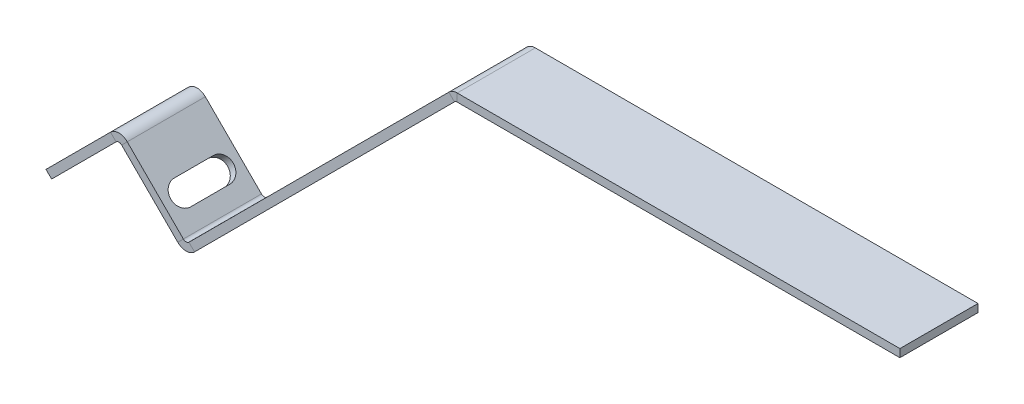
ISO-10303-21;
HEADER;
FILE_DESCRIPTION(('STEP AP214'),'2;1');
FILE_NAME('part.step','',(''),(''),'','','');
FILE_SCHEMA(('AUTOMOTIVE_DESIGN { 1 0 10303 214 1 1 1 1 }'));
ENDSEC;
DATA;
#1=APPLICATION_CONTEXT('core data for automotive mechanical design processes');
#2=APPLICATION_PROTOCOL_DEFINITION('international standard','automotive_design',2000,#1);
#3=PRODUCT_CONTEXT('',#1,'mechanical');
#4=PRODUCT('Part','Part','',(#3));
#5=PRODUCT_RELATED_PRODUCT_CATEGORY('part','',(#4));
#6=PRODUCT_DEFINITION_FORMATION('','',#4);
#7=PRODUCT_DEFINITION_CONTEXT('part definition',#1,'design');
#8=PRODUCT_DEFINITION('design','',#6,#7);
#9=PRODUCT_DEFINITION_SHAPE('','',#8);
#10=(LENGTH_UNIT() NAMED_UNIT(*) SI_UNIT(.MILLI.,.METRE.));
#11=(NAMED_UNIT(*) PLANE_ANGLE_UNIT() SI_UNIT($,.RADIAN.));
#12=(NAMED_UNIT(*) SI_UNIT($,.STERADIAN.) SOLID_ANGLE_UNIT());
#13=UNCERTAINTY_MEASURE_WITH_UNIT(LENGTH_MEASURE(1.E-05),#10,'distance_accuracy_value','');
#14=(GEOMETRIC_REPRESENTATION_CONTEXT(3) GLOBAL_UNCERTAINTY_ASSIGNED_CONTEXT((#13)) GLOBAL_UNIT_ASSIGNED_CONTEXT((#10,
#11,#12)) REPRESENTATION_CONTEXT('',''));
#15=CARTESIAN_POINT('',(0.,0.,0.));
#16=DIRECTION('',(0.,0.,1.));
#17=DIRECTION('',(1.,0.,0.));
#18=AXIS2_PLACEMENT_3D('',#15,#16,#17);
#19=CARTESIAN_POINT('',(-0.707106781186552,10.5182133701499,10.));
#20=DIRECTION('',(0.,0.,1.));
#21=DIRECTION('',(1.,0.,0.));
#22=AXIS2_PLACEMENT_3D('',#19,#20,#21);
#23=PLANE('',#22);
#24=DIRECTION('',(-0.70710678118655,0.707106781186545,0.));
#25=VECTOR('',#24,1.);
#26=CARTESIAN_POINT('',(-0.707106781186552,10.5182133701499,10.));
#27=LINE('',#26,#25);
#28=CARTESIAN_POINT('',(-0.707106781186552,10.5182133701499,10.));
#29=VERTEX_POINT('',#28);
#30=CARTESIAN_POINT('',(-2.14394776055762,11.955054349521,10.));
#31=VERTEX_POINT('',#30);
#32=EDGE_CURVE('E11',#29,#31,#27,.T.);
#33=ORIENTED_EDGE('',*,*,#32,.F.);
#34=CARTESIAN_POINT('',(0.,9.81110658896337,10.));
#35=DIRECTION('',(0.,0.,1.));
#36=DIRECTION('',(1.,0.,0.));
#37=AXIS2_PLACEMENT_3D('',#34,#35,#36);
#38=CIRCLE('',#37,1.);
#39=CARTESIAN_POINT('',(0.707106781186548,10.5182133701499,10.));
#40=VERTEX_POINT('',#39);
#41=EDGE_CURVE('E295',#29,#40,#38,.F.);
#42=ORIENTED_EDGE('',*,*,#41,.T.);
#43=DIRECTION('',(-0.707106781186549,-0.707106781186546,0.));
#44=VECTOR('',#43,1.);
#45=CARTESIAN_POINT('',(2.14394776055761,11.955054349521,10.));
#46=LINE('',#45,#44);
#47=CARTESIAN_POINT('',(2.14394776055761,11.955054349521,10.));
#48=VERTEX_POINT('',#47);
#49=EDGE_CURVE('E41',#48,#40,#46,.T.);
#50=ORIENTED_EDGE('',*,*,#49,.F.);
#51=CARTESIAN_POINT('',(0.,9.81110658896337,10.));
#52=DIRECTION('',(0.,0.,1.));
#53=DIRECTION('',(1.,0.,0.));
#54=AXIS2_PLACEMENT_3D('',#51,#52,#53);
#55=CIRCLE('',#54,3.032);
#56=EDGE_CURVE('E283',#31,#48,#55,.F.);
#57=ORIENTED_EDGE('',*,*,#56,.F.);
#58=EDGE_LOOP('',(#33,#42,#50,#57));
#59=FACE_BOUND('',#58,.T.);
#60=ADVANCED_FACE('F34',(#59),#23,.T.);
#61=CARTESIAN_POINT('',(2.14394776055761,11.955054349521,10.));
#62=DIRECTION('',(0.,0.,1.));
#63=DIRECTION('',(1.,0.,0.));
#64=AXIS2_PLACEMENT_3D('',#61,#62,#63);
#65=PLANE('',#64);
#66=DIRECTION('',(0.707106781186546,0.707106781186549,0.));
#67=VECTOR('',#66,1.);
#68=CARTESIAN_POINT('',(-17.2253201513364,-6.,10.));
#69=LINE('',#68,#67);
#70=CARTESIAN_POINT('',(-17.2253201513364,-6.,10.));
#71=VERTEX_POINT('',#70);
#72=EDGE_CURVE('E292',#71,#29,#69,.T.);
#73=ORIENTED_EDGE('',*,*,#72,.T.);
#74=ORIENTED_EDGE('',*,*,#32,.T.);
#75=DIRECTION('',(0.707106781186546,0.707106781186549,0.));
#76=VECTOR('',#75,1.);
#77=CARTESIAN_POINT('',(-18.6621611307075,-4.56315902062894,10.));
#78=LINE('',#77,#76);
#79=CARTESIAN_POINT('',(-18.6621611307075,-4.56315902062894,10.));
#80=VERTEX_POINT('',#79);
#81=EDGE_CURVE('E286',#80,#31,#78,.T.);
#82=ORIENTED_EDGE('',*,*,#81,.F.);
#83=DIRECTION('',(-0.707106781186549,0.707106781186546,0.));
#84=VECTOR('',#83,1.);
#85=CARTESIAN_POINT('',(-17.2253201513364,-6.,10.));
#86=LINE('',#85,#84);
#87=EDGE_CURVE('E289',#71,#80,#86,.T.);
#88=ORIENTED_EDGE('',*,*,#87,.F.);
#89=EDGE_LOOP('',(#73,#74,#82,#88));
#90=FACE_BOUND('',#89,.T.);
#91=ADVANCED_FACE('F460',(#90),#65,.T.);
#92=CARTESIAN_POINT('',(0.707106781186548,10.5182133701499,-10.));
#93=DIRECTION('',(0.,0.,-1.));
#94=DIRECTION('',(-1.,0.,0.));
#95=AXIS2_PLACEMENT_3D('',#92,#93,#94);
#96=PLANE('',#95);
#97=DIRECTION('',(0.707106781186549,0.707106781186546,0.));
#98=VECTOR('',#97,1.);
#99=CARTESIAN_POINT('',(0.707106781186548,10.5182133701499,-10.));
#100=LINE('',#99,#98);
#101=CARTESIAN_POINT('',(0.707106781186548,10.5182133701499,-10.));
#102=VERTEX_POINT('',#101);
#103=CARTESIAN_POINT('',(2.14394776055761,11.955054349521,-10.));
#104=VERTEX_POINT('',#103);
#105=EDGE_CURVE('E418',#102,#104,#100,.T.);
#106=ORIENTED_EDGE('',*,*,#105,.F.);
#107=CARTESIAN_POINT('',(0.,9.81110658896337,-10.));
#108=DIRECTION('',(0.,0.,1.));
#109=DIRECTION('',(1.,0.,0.));
#110=AXIS2_PLACEMENT_3D('',#107,#108,#109);
#111=CIRCLE('',#110,1.);
#112=CARTESIAN_POINT('',(-0.707106781186552,10.5182133701499,-10.));
#113=VERTEX_POINT('',#112);
#114=EDGE_CURVE('E343',#113,#102,#111,.F.);
#115=ORIENTED_EDGE('',*,*,#114,.F.);
#116=DIRECTION('',(0.70710678118655,-0.707106781186545,0.));
#117=VECTOR('',#116,1.);
#118=CARTESIAN_POINT('',(-2.14394776055762,11.955054349521,-10.));
#119=LINE('',#118,#117);
#120=CARTESIAN_POINT('',(-2.14394776055762,11.955054349521,-10.));
#121=VERTEX_POINT('',#120);
#122=EDGE_CURVE('E416',#121,#113,#119,.T.);
#123=ORIENTED_EDGE('',*,*,#122,.F.);
#124=CARTESIAN_POINT('',(0.,9.81110658896337,-10.));
#125=DIRECTION('',(0.,0.,1.));
#126=DIRECTION('',(1.,0.,0.));
#127=AXIS2_PLACEMENT_3D('',#124,#125,#126);
#128=CIRCLE('',#127,3.032);
#129=EDGE_CURVE('E331',#121,#104,#128,.F.);
#130=ORIENTED_EDGE('',*,*,#129,.T.);
#131=EDGE_LOOP('',(#106,#115,#123,#130));
#132=FACE_BOUND('',#131,.T.);
#133=ADVANCED_FACE('F470',(#132),#96,.T.);
#134=CARTESIAN_POINT('',(-2.14394776055762,11.955054349521,-10.));
#135=DIRECTION('',(0.,0.,-1.));
#136=DIRECTION('',(-1.,0.,0.));
#137=AXIS2_PLACEMENT_3D('',#134,#135,#136);
#138=PLANE('',#137);
#139=DIRECTION('',(0.707106781186546,-0.707106781186549,0.));
#140=VECTOR('',#139,1.);
#141=CARTESIAN_POINT('',(0.,11.2253201513365,-10.));
#142=LINE('',#141,#140);
#143=CARTESIAN_POINT('',(15.0813723907788,-3.85605223944237,-10.));
#144=VERTEX_POINT('',#143);
#145=EDGE_CURVE('E346',#102,#144,#142,.T.);
#146=ORIENTED_EDGE('',*,*,#145,.F.);
#147=ORIENTED_EDGE('',*,*,#105,.T.);
#148=DIRECTION('',(0.707106781186546,-0.707106781186549,0.));
#149=VECTOR('',#148,1.);
#150=CARTESIAN_POINT('',(1.43684097937107,12.6621611307075,-10.));
#151=LINE('',#150,#149);
#152=CARTESIAN_POINT('',(16.5182133701498,-2.41921126007131,-10.));
#153=VERTEX_POINT('',#152);
#154=EDGE_CURVE('E328',#104,#153,#151,.T.);
#155=ORIENTED_EDGE('',*,*,#154,.T.);
#156=DIRECTION('',(-0.70710678118655,-0.707106781186545,0.));
#157=VECTOR('',#156,1.);
#158=CARTESIAN_POINT('',(16.5182133701498,-2.41921126007131,-10.));
#159=LINE('',#158,#157);
#160=EDGE_CURVE('E408',#153,#144,#159,.T.);
#161=ORIENTED_EDGE('',*,*,#160,.T.);
#162=EDGE_LOOP('',(#146,#147,#155,#161));
#163=FACE_BOUND('',#162,.T.);
#164=ADVANCED_FACE('F472',(#163),#138,.T.);
#165=CARTESIAN_POINT('',(15.0813723907788,-3.85605223944237,10.));
#166=DIRECTION('',(0.,0.,1.));
#167=DIRECTION('',(1.,0.,0.));
#168=AXIS2_PLACEMENT_3D('',#165,#166,#167);
#169=PLANE('',#168);
#170=DIRECTION('',(0.70710678118655,0.707106781186545,0.));
#171=VECTOR('',#170,1.);
#172=CARTESIAN_POINT('',(15.0813723907788,-3.85605223944237,10.));
#173=LINE('',#172,#171);
#174=CARTESIAN_POINT('',(15.0813723907788,-3.85605223944237,10.));
#175=VERTEX_POINT('',#174);
#176=CARTESIAN_POINT('',(16.5182133701498,-2.41921126007131,10.));
#177=VERTEX_POINT('',#176);
#178=EDGE_CURVE('E414',#175,#177,#173,.T.);
#179=ORIENTED_EDGE('',*,*,#178,.F.);
#180=CARTESIAN_POINT('',(17.2253201513364,-1.71210447888477,10.));
#181=DIRECTION('',(0.,0.,-1.));
#182=DIRECTION('',(-1.,0.,0.));
#183=AXIS2_PLACEMENT_3D('',#180,#181,#182);
#184=CIRCLE('',#183,3.032);
#185=CARTESIAN_POINT('',(19.369267911894,-3.85605223944238,10.));
#186=VERTEX_POINT('',#185);
#187=EDGE_CURVE('E301',#175,#186,#184,.F.);
#188=ORIENTED_EDGE('',*,*,#187,.T.);
#189=DIRECTION('',(0.707106781186549,-0.707106781186546,0.));
#190=VECTOR('',#189,1.);
#191=CARTESIAN_POINT('',(17.9324269325229,-2.41921126007131,10.));
#192=LINE('',#191,#190);
#193=CARTESIAN_POINT('',(17.9324269325229,-2.41921126007131,10.));
#194=VERTEX_POINT('',#193);
#195=EDGE_CURVE('E412',#194,#186,#192,.T.);
#196=ORIENTED_EDGE('',*,*,#195,.F.);
#197=CARTESIAN_POINT('',(17.2253201513364,-1.71210447888477,10.));
#198=DIRECTION('',(0.,0.,1.));
#199=DIRECTION('',(1.,0.,0.));
#200=AXIS2_PLACEMENT_3D('',#197,#198,#199);
#201=CIRCLE('',#200,1.);
#202=EDGE_CURVE('E277',#177,#194,#201,.T.);
#203=ORIENTED_EDGE('',*,*,#202,.F.);
#204=EDGE_LOOP('',(#179,#188,#196,#203));
#205=FACE_BOUND('',#204,.T.);
#206=ADVANCED_FACE('F440',(#205),#169,.T.);
#207=CARTESIAN_POINT('',(17.9324269325229,-2.41921126007131,10.));
#208=DIRECTION('',(0.,0.,1.));
#209=DIRECTION('',(1.,0.,0.));
#210=AXIS2_PLACEMENT_3D('',#207,#208,#209);
#211=PLANE('',#210);
#212=DIRECTION('',(0.707106781186546,-0.707106781186549,0.));
#213=VECTOR('',#212,1.);
#214=CARTESIAN_POINT('',(0.,11.2253201513365,10.));
#215=LINE('',#214,#213);
#216=EDGE_CURVE('E298',#40,#175,#215,.T.);
#217=ORIENTED_EDGE('',*,*,#216,.T.);
#218=ORIENTED_EDGE('',*,*,#178,.T.);
#219=DIRECTION('',(0.707106781186546,-0.707106781186549,0.));
#220=VECTOR('',#219,1.);
#221=CARTESIAN_POINT('',(1.43684097937107,12.6621611307075,10.));
#222=LINE('',#221,#220);
#223=EDGE_CURVE('E280',#48,#177,#222,.T.);
#224=ORIENTED_EDGE('',*,*,#223,.F.);
#225=ORIENTED_EDGE('',*,*,#49,.T.);
#226=EDGE_LOOP('',(#217,#218,#224,#225));
#227=FACE_BOUND('',#226,.T.);
#228=ADVANCED_FACE('F421',(#227),#211,.T.);
#229=CARTESIAN_POINT('',(19.369267911894,-3.85605223944238,-10.));
#230=DIRECTION('',(0.,0.,-1.));
#231=DIRECTION('',(-1.,0.,0.));
#232=AXIS2_PLACEMENT_3D('',#229,#230,#231);
#233=PLANE('',#232);
#234=DIRECTION('',(-0.707106781186549,0.707106781186546,0.));
#235=VECTOR('',#234,1.);
#236=CARTESIAN_POINT('',(19.369267911894,-3.85605223944238,-10.));
#237=LINE('',#236,#235);
#238=CARTESIAN_POINT('',(19.369267911894,-3.85605223944238,-10.));
#239=VERTEX_POINT('',#238);
#240=CARTESIAN_POINT('',(17.9324269325229,-2.41921126007131,-10.));
#241=VERTEX_POINT('',#240);
#242=EDGE_CURVE('E410',#239,#241,#237,.T.);
#243=ORIENTED_EDGE('',*,*,#242,.F.);
#244=CARTESIAN_POINT('',(17.2253201513364,-1.71210447888477,-10.));
#245=DIRECTION('',(0.,0.,-1.));
#246=DIRECTION('',(-1.,0.,0.));
#247=AXIS2_PLACEMENT_3D('',#244,#245,#246);
#248=CIRCLE('',#247,3.032);
#249=EDGE_CURVE('E349',#144,#239,#248,.F.);
#250=ORIENTED_EDGE('',*,*,#249,.F.);
#251=ORIENTED_EDGE('',*,*,#160,.F.);
#252=CARTESIAN_POINT('',(17.2253201513364,-1.71210447888477,-10.));
#253=DIRECTION('',(0.,0.,1.));
#254=DIRECTION('',(1.,0.,0.));
#255=AXIS2_PLACEMENT_3D('',#252,#253,#254);
#256=CIRCLE('',#255,1.);
#257=EDGE_CURVE('E325',#153,#241,#256,.T.);
#258=ORIENTED_EDGE('',*,*,#257,.T.);
#259=EDGE_LOOP('',(#243,#250,#251,#258));
#260=FACE_BOUND('',#259,.T.);
#261=ADVANCED_FACE('F474',(#260),#233,.T.);
#262=CARTESIAN_POINT('',(16.5182133701498,-2.41921126007131,-10.));
#263=DIRECTION('',(0.,0.,-1.));
#264=DIRECTION('',(-1.,0.,0.));
#265=AXIS2_PLACEMENT_3D('',#262,#263,#264);
#266=PLANE('',#265);
#267=DIRECTION('',(0.707106781186546,0.707106781186549,0.));
#268=VECTOR('',#267,1.);
#269=CARTESIAN_POINT('',(17.2253201513364,-6.,-10.));
#270=LINE('',#269,#268);
#271=CARTESIAN_POINT('',(85.9324269325227,62.7071067811865,-10.));
#272=VERTEX_POINT('',#271);
#273=EDGE_CURVE('E352',#239,#272,#270,.T.);
#274=ORIENTED_EDGE('',*,*,#273,.F.);
#275=ORIENTED_EDGE('',*,*,#242,.T.);
#276=DIRECTION('',(0.707106781186546,0.707106781186549,0.));
#277=VECTOR('',#276,1.);
#278=CARTESIAN_POINT('',(15.7884791719653,-4.56315902062894,-10.));
#279=LINE('',#278,#277);
#280=CARTESIAN_POINT('',(84.4955859531516,64.1439477605576,-10.));
#281=VERTEX_POINT('',#280);
#282=EDGE_CURVE('E322',#241,#281,#279,.T.);
#283=ORIENTED_EDGE('',*,*,#282,.T.);
#284=DIRECTION('',(0.707106781186548,-0.707106781186548,0.));
#285=VECTOR('',#284,1.);
#286=CARTESIAN_POINT('',(84.4955859531516,64.1439477605576,-10.));
#287=LINE('',#286,#285);
#288=EDGE_CURVE('E400',#281,#272,#287,.T.);
#289=ORIENTED_EDGE('',*,*,#288,.T.);
#290=EDGE_LOOP('',(#274,#275,#283,#289));
#291=FACE_BOUND('',#290,.T.);
#292=ADVANCED_FACE('F480',(#291),#266,.T.);
#293=CARTESIAN_POINT('',(85.9324269325227,62.7071067811865,10.));
#294=DIRECTION('',(0.,0.,1.));
#295=DIRECTION('',(1.,0.,0.));
#296=AXIS2_PLACEMENT_3D('',#293,#294,#295);
#297=PLANE('',#296);
#298=DIRECTION('',(-0.707106781186548,0.707106781186548,0.));
#299=VECTOR('',#298,1.);
#300=CARTESIAN_POINT('',(85.9324269325227,62.7071067811865,10.));
#301=LINE('',#300,#299);
#302=CARTESIAN_POINT('',(85.9324269325227,62.7071067811865,10.));
#303=VERTEX_POINT('',#302);
#304=CARTESIAN_POINT('',(84.4955859531516,64.1439477605576,10.));
#305=VERTEX_POINT('',#304);
#306=EDGE_CURVE('E406',#303,#305,#301,.T.);
#307=ORIENTED_EDGE('',*,*,#306,.F.);
#308=CARTESIAN_POINT('',(86.6395337137093,62.,10.));
#309=DIRECTION('',(0.,0.,1.));
#310=DIRECTION('',(1.,0.,0.));
#311=AXIS2_PLACEMENT_3D('',#308,#309,#310);
#312=CIRCLE('',#311,1.);
#313=CARTESIAN_POINT('',(86.6395337137093,63.,10.));
#314=VERTEX_POINT('',#313);
#315=EDGE_CURVE('E307',#303,#314,#312,.F.);
#316=ORIENTED_EDGE('',*,*,#315,.T.);
#317=DIRECTION('',(0.,-1.,0.));
#318=VECTOR('',#317,1.);
#319=CARTESIAN_POINT('',(86.6395337137093,65.032,10.));
#320=LINE('',#319,#318);
#321=CARTESIAN_POINT('',(86.6395337137093,65.032,10.));
#322=VERTEX_POINT('',#321);
#323=EDGE_CURVE('E404',#322,#314,#320,.T.);
#324=ORIENTED_EDGE('',*,*,#323,.F.);
#325=CARTESIAN_POINT('',(86.6395337137093,62.,10.));
#326=DIRECTION('',(0.,0.,1.));
#327=DIRECTION('',(1.,0.,0.));
#328=AXIS2_PLACEMENT_3D('',#325,#326,#327);
#329=CIRCLE('',#328,3.032);
#330=EDGE_CURVE('E271',#305,#322,#329,.F.);
#331=ORIENTED_EDGE('',*,*,#330,.F.);
#332=EDGE_LOOP('',(#307,#316,#324,#331));
#333=FACE_BOUND('',#332,.T.);
#334=ADVANCED_FACE('F514',(#333),#297,.T.);
#335=CARTESIAN_POINT('',(86.6395337137093,65.032,10.));
#336=DIRECTION('',(0.,0.,1.));
#337=DIRECTION('',(1.,0.,0.));
#338=AXIS2_PLACEMENT_3D('',#335,#336,#337);
#339=PLANE('',#338);
#340=DIRECTION('',(0.707106781186546,0.707106781186549,0.));
#341=VECTOR('',#340,1.);
#342=CARTESIAN_POINT('',(17.2253201513364,-6.,10.));
#343=LINE('',#342,#341);
#344=EDGE_CURVE('E304',#186,#303,#343,.T.);
#345=ORIENTED_EDGE('',*,*,#344,.T.);
#346=ORIENTED_EDGE('',*,*,#306,.T.);
#347=DIRECTION('',(0.707106781186546,0.707106781186549,0.));
#348=VECTOR('',#347,1.);
#349=CARTESIAN_POINT('',(15.7884791719653,-4.56315902062894,10.));
#350=LINE('',#349,#348);
#351=EDGE_CURVE('E274',#194,#305,#350,.T.);
#352=ORIENTED_EDGE('',*,*,#351,.F.);
#353=ORIENTED_EDGE('',*,*,#195,.T.);
#354=EDGE_LOOP('',(#345,#346,#352,#353));
#355=FACE_BOUND('',#354,.T.);
#356=ADVANCED_FACE('F516',(#355),#339,.T.);
#357=CARTESIAN_POINT('',(86.6395337137093,63.,-10.));
#358=DIRECTION('',(0.,0.,-1.));
#359=DIRECTION('',(-1.,0.,0.));
#360=AXIS2_PLACEMENT_3D('',#357,#358,#359);
#361=PLANE('',#360);
#362=DIRECTION('',(0.,1.,0.));
#363=VECTOR('',#362,1.);
#364=CARTESIAN_POINT('',(86.6395337137093,63.,-10.));
#365=LINE('',#364,#363);
#366=CARTESIAN_POINT('',(86.6395337137093,63.,-10.));
#367=VERTEX_POINT('',#366);
#368=CARTESIAN_POINT('',(86.6395337137093,65.032,-10.));
#369=VERTEX_POINT('',#368);
#370=EDGE_CURVE('E402',#367,#369,#365,.T.);
#371=ORIENTED_EDGE('',*,*,#370,.F.);
#372=CARTESIAN_POINT('',(86.6395337137093,62.,-10.));
#373=DIRECTION('',(0.,0.,1.));
#374=DIRECTION('',(1.,0.,0.));
#375=AXIS2_PLACEMENT_3D('',#372,#373,#374);
#376=CIRCLE('',#375,1.);
#377=EDGE_CURVE('E265',#272,#367,#376,.F.);
#378=ORIENTED_EDGE('',*,*,#377,.F.);
#379=ORIENTED_EDGE('',*,*,#288,.F.);
#380=CARTESIAN_POINT('',(86.6395337137093,62.,-10.));
#381=DIRECTION('',(0.,0.,1.));
#382=DIRECTION('',(1.,0.,0.));
#383=AXIS2_PLACEMENT_3D('',#380,#381,#382);
#384=CIRCLE('',#383,3.032);
#385=EDGE_CURVE('E319',#281,#369,#384,.F.);
#386=ORIENTED_EDGE('',*,*,#385,.T.);
#387=EDGE_LOOP('',(#371,#378,#379,#386));
#388=FACE_BOUND('',#387,.T.);
#389=ADVANCED_FACE('F484',(#388),#361,.T.);
#390=CARTESIAN_POINT('',(84.4955859531516,64.1439477605576,-10.));
#391=DIRECTION('',(0.,0.,-1.));
#392=DIRECTION('',(-1.,0.,0.));
#393=AXIS2_PLACEMENT_3D('',#390,#391,#392);
#394=PLANE('',#393);
#395=DIRECTION('',(1.,0.,0.));
#396=VECTOR('',#395,1.);
#397=CARTESIAN_POINT('',(86.2253201513362,63.,-10.));
#398=LINE('',#397,#396);
#399=CARTESIAN_POINT('',(200.,63.,-10.));
#400=VERTEX_POINT('',#399);
#401=EDGE_CURVE('E255',#367,#400,#398,.T.);
#402=ORIENTED_EDGE('',*,*,#401,.F.);
#403=ORIENTED_EDGE('',*,*,#370,.T.);
#404=DIRECTION('',(1.,0.,0.));
#405=VECTOR('',#404,1.);
#406=CARTESIAN_POINT('',(86.2253201513362,65.032,-10.));
#407=LINE('',#406,#405);
#408=CARTESIAN_POINT('',(200.,65.032,-10.));
#409=VERTEX_POINT('',#408);
#410=EDGE_CURVE('E316',#369,#409,#407,.T.);
#411=ORIENTED_EDGE('',*,*,#410,.T.);
#412=DIRECTION('',(0.,-1.,0.));
#413=VECTOR('',#412,1.);
#414=CARTESIAN_POINT('',(200.,65.032,-10.));
#415=LINE('',#414,#413);
#416=EDGE_CURVE('E313',#409,#400,#415,.T.);
#417=ORIENTED_EDGE('',*,*,#416,.T.);
#418=EDGE_LOOP('',(#402,#403,#411,#417));
#419=FACE_BOUND('',#418,.T.);
#420=ADVANCED_FACE('F501',(#419),#394,.T.);
#421=CARTESIAN_POINT('',(86.2253201513362,63.,10.));
#422=DIRECTION('',(0.,1.,0.));
#423=DIRECTION('',(0.,0.,1.));
#424=AXIS2_PLACEMENT_3D('',#421,#422,#423);
#425=PLANE('',#424);
#426=ORIENTED_EDGE('',*,*,#401,.T.);
#427=DIRECTION('',(0.,0.,-1.));
#428=VECTOR('',#427,1.);
#429=CARTESIAN_POINT('',(200.,63.,10.));
#430=LINE('',#429,#428);
#431=CARTESIAN_POINT('',(200.,63.,10.));
#432=VERTEX_POINT('',#431);
#433=EDGE_CURVE('E398',#432,#400,#430,.T.);
#434=ORIENTED_EDGE('',*,*,#433,.F.);
#435=DIRECTION('',(1.,0.,0.));
#436=VECTOR('',#435,1.);
#437=CARTESIAN_POINT('',(86.2253201513362,63.,10.));
#438=LINE('',#437,#436);
#439=EDGE_CURVE('E262',#314,#432,#438,.T.);
#440=ORIENTED_EDGE('',*,*,#439,.F.);
#441=DIRECTION('',(0.,0.,-1.));
#442=VECTOR('',#441,1.);
#443=CARTESIAN_POINT('',(86.6395337137093,63.,10.));
#444=LINE('',#443,#442);
#445=EDGE_CURVE('E310',#314,#367,#444,.T.);
#446=ORIENTED_EDGE('',*,*,#445,.T.);
#447=EDGE_LOOP('',(#426,#434,#440,#446));
#448=FACE_BOUND('',#447,.T.);
#449=ADVANCED_FACE('F508',(#448),#425,.F.);
#450=CARTESIAN_POINT('',(200.,65.032,10.));
#451=DIRECTION('',(1.,0.,0.));
#452=DIRECTION('',(0.,0.,-1.));
#453=AXIS2_PLACEMENT_3D('',#450,#451,#452);
#454=PLANE('',#453);
#455=ORIENTED_EDGE('',*,*,#416,.F.);
#456=DIRECTION('',(0.,0.,-1.));
#457=VECTOR('',#456,1.);
#458=CARTESIAN_POINT('',(200.,65.032,10.));
#459=LINE('',#458,#457);
#460=CARTESIAN_POINT('',(200.,65.032,10.));
#461=VERTEX_POINT('',#460);
#462=EDGE_CURVE('E396',#461,#409,#459,.T.);
#463=ORIENTED_EDGE('',*,*,#462,.F.);
#464=DIRECTION('',(0.,-1.,0.));
#465=VECTOR('',#464,1.);
#466=CARTESIAN_POINT('',(200.,65.032,10.));
#467=LINE('',#466,#465);
#468=EDGE_CURVE('E264',#461,#432,#467,.T.);
#469=ORIENTED_EDGE('',*,*,#468,.T.);
#470=ORIENTED_EDGE('',*,*,#433,.T.);
#471=EDGE_LOOP('',(#455,#463,#469,#470));
#472=FACE_BOUND('',#471,.T.);
#473=ADVANCED_FACE('F582',(#472),#454,.T.);
#474=CARTESIAN_POINT('',(86.2253201513362,65.032,10.));
#475=DIRECTION('',(0.,1.,0.));
#476=DIRECTION('',(0.,0.,1.));
#477=AXIS2_PLACEMENT_3D('',#474,#475,#476);
#478=PLANE('',#477);
#479=ORIENTED_EDGE('',*,*,#410,.F.);
#480=DIRECTION('',(0.,0.,-1.));
#481=VECTOR('',#480,1.);
#482=CARTESIAN_POINT('',(86.6395337137093,65.032,10.));
#483=LINE('',#482,#481);
#484=EDGE_CURVE('E393',#322,#369,#483,.T.);
#485=ORIENTED_EDGE('',*,*,#484,.F.);
#486=DIRECTION('',(1.,0.,0.));
#487=VECTOR('',#486,1.);
#488=CARTESIAN_POINT('',(86.2253201513362,65.032,10.));
#489=LINE('',#488,#487);
#490=EDGE_CURVE('E268',#322,#461,#489,.T.);
#491=ORIENTED_EDGE('',*,*,#490,.T.);
#492=ORIENTED_EDGE('',*,*,#462,.T.);
#493=EDGE_LOOP('',(#479,#485,#491,#492));
#494=FACE_BOUND('',#493,.T.);
#495=ADVANCED_FACE('F497',(#494),#478,.T.);
#496=CARTESIAN_POINT('',(86.6395337137093,62.,10.));
#497=DIRECTION('',(0.,0.,-1.));
#498=DIRECTION('',(-1.,0.,0.));
#499=AXIS2_PLACEMENT_3D('',#496,#497,#498);
#500=CYLINDRICAL_SURFACE('',#499,3.032);
#501=ORIENTED_EDGE('',*,*,#385,.F.);
#502=DIRECTION('',(0.,0.,-1.));
#503=VECTOR('',#502,1.);
#504=CARTESIAN_POINT('',(84.4955859531516,64.1439477605576,10.));
#505=LINE('',#504,#503);
#506=EDGE_CURVE('E390',#305,#281,#505,.T.);
#507=ORIENTED_EDGE('',*,*,#506,.F.);
#508=ORIENTED_EDGE('',*,*,#330,.T.);
#509=ORIENTED_EDGE('',*,*,#484,.T.);
#510=EDGE_LOOP('',(#501,#507,#508,#509));
#511=FACE_BOUND('',#510,.T.);
#512=ADVANCED_FACE('F492',(#511),#500,.T.);
#513=CARTESIAN_POINT('',(15.7884791719653,-4.56315902062894,10.));
#514=DIRECTION('',(-0.707106781186549,0.707106781186546,0.));
#515=DIRECTION('',(-0.707106781186546,-0.707106781186549,0.));
#516=AXIS2_PLACEMENT_3D('',#513,#514,#515);
#517=PLANE('',#516);
#518=ORIENTED_EDGE('',*,*,#282,.F.);
#519=DIRECTION('',(0.,0.,-1.));
#520=VECTOR('',#519,1.);
#521=CARTESIAN_POINT('',(17.9324269325229,-2.41921126007131,10.));
#522=LINE('',#521,#520);
#523=EDGE_CURVE('E387',#194,#241,#522,.T.);
#524=ORIENTED_EDGE('',*,*,#523,.F.);
#525=ORIENTED_EDGE('',*,*,#351,.T.);
#526=ORIENTED_EDGE('',*,*,#506,.T.);
#527=EDGE_LOOP('',(#518,#524,#525,#526));
#528=FACE_BOUND('',#527,.T.);
#529=ADVANCED_FACE('F488',(#528),#517,.T.);
#530=CARTESIAN_POINT('',(17.2253201513364,-1.71210447888477,10.));
#531=DIRECTION('',(0.,0.,-1.));
#532=DIRECTION('',(-1.,0.,0.));
#533=AXIS2_PLACEMENT_3D('',#530,#531,#532);
#534=CYLINDRICAL_SURFACE('',#533,1.);
#535=ORIENTED_EDGE('',*,*,#257,.F.);
#536=DIRECTION('',(0.,0.,-1.));
#537=VECTOR('',#536,1.);
#538=CARTESIAN_POINT('',(16.5182133701498,-2.41921126007131,10.));
#539=LINE('',#538,#537);
#540=EDGE_CURVE('E384',#177,#153,#539,.T.);
#541=ORIENTED_EDGE('',*,*,#540,.F.);
#542=ORIENTED_EDGE('',*,*,#202,.T.);
#543=ORIENTED_EDGE('',*,*,#523,.T.);
#544=EDGE_LOOP('',(#535,#541,#542,#543));
#545=FACE_BOUND('',#544,.T.);
#546=ADVANCED_FACE('F446',(#545),#534,.F.);
#547=CARTESIAN_POINT('',(1.43684097937107,12.6621611307075,10.));
#548=DIRECTION('',(0.707106781186549,0.707106781186546,0.));
#549=DIRECTION('',(-0.707106781186546,0.707106781186549,0.));
#550=AXIS2_PLACEMENT_3D('',#547,#548,#549);
#551=PLANE('',#550);
#552=CARTESIAN_POINT('',(11.2921417421586,2.80686036791998,5.));
#553=DIRECTION('',(0.707106781186549,0.707106781186546,0.));
#554=DIRECTION('',(-0.707106781186546,0.707106781186549,0.));
#555=AXIS2_PLACEMENT_3D('',#552,#553,#554);
#556=CIRCLE('',#555,3.);
#557=CARTESIAN_POINT('',(9.17082139859894,4.92818071147963,5.));
#558=VERTEX_POINT('',#557);
#559=CARTESIAN_POINT('',(13.4134620857182,0.685540024360333,5.));
#560=VERTEX_POINT('',#559);
#561=EDGE_CURVE('E48',#558,#560,#556,.T.);
#562=ORIENTED_EDGE('',*,*,#561,.F.);
#563=DIRECTION('',(0.,0.,1.));
#564=VECTOR('',#563,1.);
#565=CARTESIAN_POINT('',(9.17082139859894,4.92818071147963,5.));
#566=LINE('',#565,#564);
#567=CARTESIAN_POINT('',(9.17082139859894,4.92818071147963,-5.));
#568=VERTEX_POINT('',#567);
#569=EDGE_CURVE('E211',#568,#558,#566,.T.);
#570=ORIENTED_EDGE('',*,*,#569,.F.);
#571=CARTESIAN_POINT('',(11.2921417421586,2.80686036791998,-5.));
#572=DIRECTION('',(0.707106781186549,0.707106781186546,0.));
#573=DIRECTION('',(-0.707106781186546,0.707106781186549,0.));
#574=AXIS2_PLACEMENT_3D('',#571,#572,#573);
#575=CIRCLE('',#574,3.);
#576=CARTESIAN_POINT('',(13.4134620857182,0.685540024360335,-5.));
#577=VERTEX_POINT('',#576);
#578=EDGE_CURVE('E214',#577,#568,#575,.T.);
#579=ORIENTED_EDGE('',*,*,#578,.F.);
#580=DIRECTION('',(0.,0.,-1.));
#581=VECTOR('',#580,1.);
#582=CARTESIAN_POINT('',(13.4134620857182,0.685540024360335,5.));
#583=LINE('',#582,#581);
#584=EDGE_CURVE('E220',#560,#577,#583,.T.);
#585=ORIENTED_EDGE('',*,*,#584,.F.);
#586=EDGE_LOOP('',(#562,#570,#579,#585));
#587=FACE_BOUND('',#586,.T.);
#588=ORIENTED_EDGE('',*,*,#154,.F.);
#589=DIRECTION('',(0.,0.,-1.));
#590=VECTOR('',#589,1.);
#591=CARTESIAN_POINT('',(2.14394776055761,11.955054349521,10.));
#592=LINE('',#591,#590);
#593=EDGE_CURVE('E381',#48,#104,#592,.T.);
#594=ORIENTED_EDGE('',*,*,#593,.F.);
#595=ORIENTED_EDGE('',*,*,#223,.T.);
#596=ORIENTED_EDGE('',*,*,#540,.T.);
#597=EDGE_LOOP('',(#588,#594,#595,#596));
#598=FACE_BOUND('',#597,.T.);
#599=ADVANCED_FACE('F449',(#587,#598),#551,.T.);
#600=CARTESIAN_POINT('',(0.,9.81110658896337,10.));
#601=DIRECTION('',(0.,0.,-1.));
#602=DIRECTION('',(-1.,0.,0.));
#603=AXIS2_PLACEMENT_3D('',#600,#601,#602);
#604=CYLINDRICAL_SURFACE('',#603,3.032);
#605=ORIENTED_EDGE('',*,*,#129,.F.);
#606=DIRECTION('',(0.,0.,-1.));
#607=VECTOR('',#606,1.);
#608=CARTESIAN_POINT('',(-2.14394776055762,11.955054349521,10.));
#609=LINE('',#608,#607);
#610=EDGE_CURVE('E378',#31,#121,#609,.T.);
#611=ORIENTED_EDGE('',*,*,#610,.F.);
#612=ORIENTED_EDGE('',*,*,#56,.T.);
#613=ORIENTED_EDGE('',*,*,#593,.T.);
#614=EDGE_LOOP('',(#605,#611,#612,#613));
#615=FACE_BOUND('',#614,.T.);
#616=ADVANCED_FACE('F452',(#615),#604,.T.);
#617=CARTESIAN_POINT('',(-18.6621611307075,-4.56315902062894,10.));
#618=DIRECTION('',(-0.707106781186549,0.707106781186546,0.));
#619=DIRECTION('',(-0.707106781186546,-0.707106781186549,0.));
#620=AXIS2_PLACEMENT_3D('',#617,#618,#619);
#621=PLANE('',#620);
#622=CARTESIAN_POINT('',(-12.7063553045317,1.39264680554689,-5.));
#623=DIRECTION('',(-0.707106781186549,0.707106781186546,0.));
#624=DIRECTION('',(-0.707106781186546,-0.707106781186549,0.));
#625=AXIS2_PLACEMENT_3D('',#622,#623,#624);
#626=CIRCLE('',#625,3.);
#627=CARTESIAN_POINT('',(-10.585034960972,3.51396714910653,-5.));
#628=VERTEX_POINT('',#627);
#629=CARTESIAN_POINT('',(-14.8276756480913,-0.728673538012763,-5.));
#630=VERTEX_POINT('',#629);
#631=EDGE_CURVE('E226',#628,#630,#626,.T.);
#632=ORIENTED_EDGE('',*,*,#631,.F.);
#633=DIRECTION('',(0.,0.,-1.));
#634=VECTOR('',#633,1.);
#635=CARTESIAN_POINT('',(-10.585034960972,3.51396714910653,-5.));
#636=LINE('',#635,#634);
#637=CARTESIAN_POINT('',(-10.585034960972,3.51396714910653,5.));
#638=VERTEX_POINT('',#637);
#639=EDGE_CURVE('E234',#638,#628,#636,.T.);
#640=ORIENTED_EDGE('',*,*,#639,.F.);
#641=CARTESIAN_POINT('',(-12.7063553045317,1.39264680554689,5.));
#642=DIRECTION('',(-0.707106781186549,0.707106781186546,0.));
#643=DIRECTION('',(-0.707106781186546,-0.707106781186549,0.));
#644=AXIS2_PLACEMENT_3D('',#641,#642,#643);
#645=CIRCLE('',#644,3.);
#646=CARTESIAN_POINT('',(-14.8276756480913,-0.72867353801276,5.));
#647=VERTEX_POINT('',#646);
#648=EDGE_CURVE('E248',#647,#638,#645,.T.);
#649=ORIENTED_EDGE('',*,*,#648,.F.);
#650=DIRECTION('',(0.,0.,1.));
#651=VECTOR('',#650,1.);
#652=CARTESIAN_POINT('',(-14.8276756480913,-0.72867353801276,-5.));
#653=LINE('',#652,#651);
#654=EDGE_CURVE('E245',#630,#647,#653,.T.);
#655=ORIENTED_EDGE('',*,*,#654,.F.);
#656=EDGE_LOOP('',(#632,#640,#649,#655));
#657=FACE_BOUND('',#656,.T.);
#658=DIRECTION('',(0.707106781186546,0.707106781186549,0.));
#659=VECTOR('',#658,1.);
#660=CARTESIAN_POINT('',(-18.6621611307075,-4.56315902062894,-10.));
#661=LINE('',#660,#659);
#662=CARTESIAN_POINT('',(-18.6621611307075,-4.56315902062894,-10.));
#663=VERTEX_POINT('',#662);
#664=EDGE_CURVE('E334',#663,#121,#661,.T.);
#665=ORIENTED_EDGE('',*,*,#664,.F.);
#666=DIRECTION('',(0.,0.,-1.));
#667=VECTOR('',#666,1.);
#668=CARTESIAN_POINT('',(-18.6621611307075,-4.56315902062894,10.));
#669=LINE('',#668,#667);
#670=EDGE_CURVE('E376',#80,#663,#669,.T.);
#671=ORIENTED_EDGE('',*,*,#670,.F.);
#672=ORIENTED_EDGE('',*,*,#81,.T.);
#673=ORIENTED_EDGE('',*,*,#610,.T.);
#674=EDGE_LOOP('',(#665,#671,#672,#673));
#675=FACE_BOUND('',#674,.T.);
#676=ADVANCED_FACE('F457',(#657,#675),#621,.T.);
#677=CARTESIAN_POINT('',(-17.2253201513364,-6.,10.));
#678=DIRECTION('',(-0.707106781186546,-0.707106781186549,0.));
#679=DIRECTION('',(0.707106781186549,-0.707106781186546,0.));
#680=AXIS2_PLACEMENT_3D('',#677,#678,#679);
#681=PLANE('',#680);
#682=DIRECTION('',(-0.707106781186549,0.707106781186546,0.));
#683=VECTOR('',#682,1.);
#684=CARTESIAN_POINT('',(-17.2253201513364,-6.,-10.));
#685=LINE('',#684,#683);
#686=CARTESIAN_POINT('',(-17.2253201513364,-6.,-10.));
#687=VERTEX_POINT('',#686);
#688=EDGE_CURVE('E337',#687,#663,#685,.T.);
#689=ORIENTED_EDGE('',*,*,#688,.F.);
#690=DIRECTION('',(0.,0.,-1.));
#691=VECTOR('',#690,1.);
#692=CARTESIAN_POINT('',(-17.2253201513364,-6.,10.));
#693=LINE('',#692,#691);
#694=EDGE_CURVE('E374',#71,#687,#693,.T.);
#695=ORIENTED_EDGE('',*,*,#694,.F.);
#696=ORIENTED_EDGE('',*,*,#87,.T.);
#697=ORIENTED_EDGE('',*,*,#670,.T.);
#698=EDGE_LOOP('',(#689,#695,#696,#697));
#699=FACE_BOUND('',#698,.T.);
#700=ADVANCED_FACE('F463',(#699),#681,.T.);
#701=CARTESIAN_POINT('',(-17.2253201513364,-6.,10.));
#702=DIRECTION('',(-0.707106781186549,0.707106781186546,0.));
#703=DIRECTION('',(-0.707106781186546,-0.707106781186549,0.));
#704=AXIS2_PLACEMENT_3D('',#701,#702,#703);
#705=PLANE('',#704);
#706=DIRECTION('',(0.,0.,-1.));
#707=VECTOR('',#706,1.);
#708=CARTESIAN_POINT('',(-9.14819398160096,2.07712616973547,-5.));
#709=LINE('',#708,#707);
#710=CARTESIAN_POINT('',(-9.14819398160096,2.07712616973547,5.));
#711=VERTEX_POINT('',#710);
#712=CARTESIAN_POINT('',(-9.14819398160096,2.07712616973547,-5.));
#713=VERTEX_POINT('',#712);
#714=EDGE_CURVE('E240',#711,#713,#709,.T.);
#715=ORIENTED_EDGE('',*,*,#714,.T.);
#716=CARTESIAN_POINT('',(-11.2695143251606,-0.044194173824176,-5.));
#717=DIRECTION('',(-0.707106781186549,0.707106781186546,0.));
#718=DIRECTION('',(-0.707106781186546,-0.707106781186549,0.));
#719=AXIS2_PLACEMENT_3D('',#716,#717,#718);
#720=CIRCLE('',#719,3.);
#721=CARTESIAN_POINT('',(-13.3908346687202,-2.16551451738382,-5.));
#722=VERTEX_POINT('',#721);
#723=EDGE_CURVE('E230',#713,#722,#720,.T.);
#724=ORIENTED_EDGE('',*,*,#723,.T.);
#725=DIRECTION('',(0.,0.,1.));
#726=VECTOR('',#725,1.);
#727=CARTESIAN_POINT('',(-13.3908346687202,-2.16551451738382,-5.));
#728=LINE('',#727,#726);
#729=CARTESIAN_POINT('',(-13.3908346687202,-2.16551451738383,5.));
#730=VERTEX_POINT('',#729);
#731=EDGE_CURVE('E233',#722,#730,#728,.T.);
#732=ORIENTED_EDGE('',*,*,#731,.T.);
#733=CARTESIAN_POINT('',(-11.2695143251606,-0.044194173824176,5.));
#734=DIRECTION('',(-0.707106781186549,0.707106781186546,0.));
#735=DIRECTION('',(-0.707106781186546,-0.707106781186549,0.));
#736=AXIS2_PLACEMENT_3D('',#733,#734,#735);
#737=CIRCLE('',#736,3.);
#738=EDGE_CURVE('E237',#730,#711,#737,.T.);
#739=ORIENTED_EDGE('',*,*,#738,.T.);
#740=EDGE_LOOP('',(#715,#724,#732,#739));
#741=FACE_BOUND('',#740,.T.);
#742=DIRECTION('',(0.707106781186546,0.707106781186549,0.));
#743=VECTOR('',#742,1.);
#744=CARTESIAN_POINT('',(-17.2253201513364,-6.,-10.));
#745=LINE('',#744,#743);
#746=EDGE_CURVE('E340',#687,#113,#745,.T.);
#747=ORIENTED_EDGE('',*,*,#746,.T.);
#748=DIRECTION('',(0.,0.,-1.));
#749=VECTOR('',#748,1.);
#750=CARTESIAN_POINT('',(-0.707106781186552,10.5182133701499,10.));
#751=LINE('',#750,#749);
#752=EDGE_CURVE('E371',#29,#113,#751,.T.);
#753=ORIENTED_EDGE('',*,*,#752,.F.);
#754=ORIENTED_EDGE('',*,*,#72,.F.);
#755=ORIENTED_EDGE('',*,*,#694,.T.);
#756=EDGE_LOOP('',(#747,#753,#754,#755));
#757=FACE_BOUND('',#756,.T.);
#758=ADVANCED_FACE('F468',(#741,#757),#705,.F.);
#759=CARTESIAN_POINT('',(0.,9.81110658896337,10.));
#760=DIRECTION('',(0.,0.,-1.));
#761=DIRECTION('',(-1.,0.,0.));
#762=AXIS2_PLACEMENT_3D('',#759,#760,#761);
#763=CYLINDRICAL_SURFACE('',#762,1.);
#764=ORIENTED_EDGE('',*,*,#114,.T.);
#765=DIRECTION('',(0.,0.,-1.));
#766=VECTOR('',#765,1.);
#767=CARTESIAN_POINT('',(0.707106781186548,10.5182133701499,10.));
#768=LINE('',#767,#766);
#769=EDGE_CURVE('E368',#40,#102,#768,.T.);
#770=ORIENTED_EDGE('',*,*,#769,.F.);
#771=ORIENTED_EDGE('',*,*,#41,.F.);
#772=ORIENTED_EDGE('',*,*,#752,.T.);
#773=EDGE_LOOP('',(#764,#770,#771,#772));
#774=FACE_BOUND('',#773,.T.);
#775=ADVANCED_FACE('F430',(#774),#763,.F.);
#776=CARTESIAN_POINT('',(0.,11.2253201513365,10.));
#777=DIRECTION('',(0.707106781186549,0.707106781186546,0.));
#778=DIRECTION('',(-0.707106781186546,0.707106781186549,0.));
#779=AXIS2_PLACEMENT_3D('',#776,#777,#778);
#780=PLANE('',#779);
#781=DIRECTION('',(0.,0.,1.));
#782=VECTOR('',#781,1.);
#783=CARTESIAN_POINT('',(7.73398041922787,3.49133973210856,5.));
#784=LINE('',#783,#782);
#785=CARTESIAN_POINT('',(7.73398041922787,3.49133973210856,-5.));
#786=VERTEX_POINT('',#785);
#787=CARTESIAN_POINT('',(7.73398041922787,3.49133973210856,5.));
#788=VERTEX_POINT('',#787);
#789=EDGE_CURVE('E201',#786,#788,#784,.T.);
#790=ORIENTED_EDGE('',*,*,#789,.T.);
#791=CARTESIAN_POINT('',(9.85530076278751,1.37001938854892,5.));
#792=DIRECTION('',(0.707106781186549,0.707106781186546,0.));
#793=DIRECTION('',(-0.707106781186546,0.707106781186549,0.));
#794=AXIS2_PLACEMENT_3D('',#791,#792,#793);
#795=CIRCLE('',#794,3.);
#796=CARTESIAN_POINT('',(11.9766211063471,-0.751300955010727,5.));
#797=VERTEX_POINT('',#796);
#798=EDGE_CURVE('E195',#788,#797,#795,.T.);
#799=ORIENTED_EDGE('',*,*,#798,.T.);
#800=DIRECTION('',(0.,0.,-1.));
#801=VECTOR('',#800,1.);
#802=CARTESIAN_POINT('',(11.9766211063471,-0.751300955010727,5.));
#803=LINE('',#802,#801);
#804=CARTESIAN_POINT('',(11.9766211063471,-0.751300955010728,-5.));
#805=VERTEX_POINT('',#804);
#806=EDGE_CURVE('E204',#797,#805,#803,.T.);
#807=ORIENTED_EDGE('',*,*,#806,.T.);
#808=CARTESIAN_POINT('',(9.85530076278751,1.37001938854892,-5.));
#809=DIRECTION('',(0.707106781186549,0.707106781186546,0.));
#810=DIRECTION('',(-0.707106781186546,0.707106781186549,0.));
#811=AXIS2_PLACEMENT_3D('',#808,#809,#810);
#812=CIRCLE('',#811,3.);
#813=EDGE_CURVE('E56',#805,#786,#812,.T.);
#814=ORIENTED_EDGE('',*,*,#813,.T.);
#815=EDGE_LOOP('',(#790,#799,#807,#814));
#816=FACE_BOUND('',#815,.T.);
#817=ORIENTED_EDGE('',*,*,#145,.T.);
#818=DIRECTION('',(0.,0.,-1.));
#819=VECTOR('',#818,1.);
#820=CARTESIAN_POINT('',(15.0813723907788,-3.85605223944237,10.));
#821=LINE('',#820,#819);
#822=EDGE_CURVE('E365',#175,#144,#821,.T.);
#823=ORIENTED_EDGE('',*,*,#822,.F.);
#824=ORIENTED_EDGE('',*,*,#216,.F.);
#825=ORIENTED_EDGE('',*,*,#769,.T.);
#826=EDGE_LOOP('',(#817,#823,#824,#825));
#827=FACE_BOUND('',#826,.T.);
#828=ADVANCED_FACE('F208',(#816,#827),#780,.F.);
#829=CARTESIAN_POINT('',(17.2253201513364,-1.71210447888477,10.));
#830=DIRECTION('',(0.,0.,-1.));
#831=DIRECTION('',(-1.,0.,0.));
#832=AXIS2_PLACEMENT_3D('',#829,#830,#831);
#833=CYLINDRICAL_SURFACE('',#832,3.032);
#834=ORIENTED_EDGE('',*,*,#249,.T.);
#835=DIRECTION('',(0.,0.,-1.));
#836=VECTOR('',#835,1.);
#837=CARTESIAN_POINT('',(19.369267911894,-3.85605223944238,10.));
#838=LINE('',#837,#836);
#839=EDGE_CURVE('E362',#186,#239,#838,.T.);
#840=ORIENTED_EDGE('',*,*,#839,.F.);
#841=ORIENTED_EDGE('',*,*,#187,.F.);
#842=ORIENTED_EDGE('',*,*,#822,.T.);
#843=EDGE_LOOP('',(#834,#840,#841,#842));
#844=FACE_BOUND('',#843,.T.);
#845=ADVANCED_FACE('F437',(#844),#833,.T.);
#846=CARTESIAN_POINT('',(17.2253201513364,-6.,10.));
#847=DIRECTION('',(-0.707106781186549,0.707106781186546,0.));
#848=DIRECTION('',(-0.707106781186546,-0.707106781186549,0.));
#849=AXIS2_PLACEMENT_3D('',#846,#847,#848);
#850=PLANE('',#849);
#851=ORIENTED_EDGE('',*,*,#273,.T.);
#852=DIRECTION('',(0.,0.,-1.));
#853=VECTOR('',#852,1.);
#854=CARTESIAN_POINT('',(85.9324269325227,62.7071067811865,10.));
#855=LINE('',#854,#853);
#856=EDGE_CURVE('E359',#303,#272,#855,.T.);
#857=ORIENTED_EDGE('',*,*,#856,.F.);
#858=ORIENTED_EDGE('',*,*,#344,.F.);
#859=ORIENTED_EDGE('',*,*,#839,.T.);
#860=EDGE_LOOP('',(#851,#857,#858,#859));
#861=FACE_BOUND('',#860,.T.);
#862=ADVANCED_FACE('F477',(#861),#850,.F.);
#863=CARTESIAN_POINT('',(86.6395337137093,62.,10.));
#864=DIRECTION('',(0.,0.,-1.));
#865=DIRECTION('',(-1.,0.,0.));
#866=AXIS2_PLACEMENT_3D('',#863,#864,#865);
#867=CYLINDRICAL_SURFACE('',#866,1.);
#868=ORIENTED_EDGE('',*,*,#377,.T.);
#869=ORIENTED_EDGE('',*,*,#445,.F.);
#870=ORIENTED_EDGE('',*,*,#315,.F.);
#871=ORIENTED_EDGE('',*,*,#856,.T.);
#872=EDGE_LOOP('',(#868,#869,#870,#871));
#873=FACE_BOUND('',#872,.T.);
#874=ADVANCED_FACE('F504',(#873),#867,.F.);
#875=CARTESIAN_POINT('',(86.6395337137093,62.,10.));
#876=DIRECTION('',(0.,0.,1.));
#877=DIRECTION('',(1.,0.,0.));
#878=AXIS2_PLACEMENT_3D('',#875,#876,#877);
#879=PLANE('',#878);
#880=ORIENTED_EDGE('',*,*,#439,.T.);
#881=ORIENTED_EDGE('',*,*,#468,.F.);
#882=ORIENTED_EDGE('',*,*,#490,.F.);
#883=ORIENTED_EDGE('',*,*,#323,.T.);
#884=EDGE_LOOP('',(#880,#881,#882,#883));
#885=FACE_BOUND('',#884,.T.);
#886=ADVANCED_FACE('F512',(#885),#879,.T.);
#887=CARTESIAN_POINT('',(86.6395337137093,62.,-10.));
#888=DIRECTION('',(0.,0.,1.));
#889=DIRECTION('',(1.,0.,0.));
#890=AXIS2_PLACEMENT_3D('',#887,#888,#889);
#891=PLANE('',#890);
#892=ORIENTED_EDGE('',*,*,#664,.T.);
#893=ORIENTED_EDGE('',*,*,#122,.T.);
#894=ORIENTED_EDGE('',*,*,#746,.F.);
#895=ORIENTED_EDGE('',*,*,#688,.T.);
#896=EDGE_LOOP('',(#892,#893,#894,#895));
#897=FACE_BOUND('',#896,.T.);
#898=ADVANCED_FACE('F700',(#897),#891,.F.);
#899=CARTESIAN_POINT('',(-11.2695143251606,-0.044194173824176,-5.));
#900=DIRECTION('',(-0.707106781186549,0.707106781186546,0.));
#901=DIRECTION('',(-0.707106781186546,-0.707106781186549,0.));
#902=AXIS2_PLACEMENT_3D('',#899,#900,#901);
#903=CYLINDRICAL_SURFACE('',#902,3.);
#904=ORIENTED_EDGE('',*,*,#631,.T.);
#905=DIRECTION('',(-0.707106781186549,0.707106781186546,0.));
#906=VECTOR('',#905,1.);
#907=CARTESIAN_POINT('',(-13.3908346687202,-2.16551451738382,-5.));
#908=LINE('',#907,#906);
#909=EDGE_CURVE('E243',#722,#630,#908,.T.);
#910=ORIENTED_EDGE('',*,*,#909,.F.);
#911=ORIENTED_EDGE('',*,*,#723,.F.);
#912=DIRECTION('',(-0.707106781186549,0.707106781186546,0.));
#913=VECTOR('',#912,1.);
#914=CARTESIAN_POINT('',(-9.14819398160096,2.07712616973547,-5.));
#915=LINE('',#914,#913);
#916=EDGE_CURVE('E253',#713,#628,#915,.T.);
#917=ORIENTED_EDGE('',*,*,#916,.T.);
#918=EDGE_LOOP('',(#904,#910,#911,#917));
#919=FACE_BOUND('',#918,.T.);
#920=ADVANCED_FACE('F710',(#919),#903,.F.);
#921=CARTESIAN_POINT('',(-9.14819398160096,2.07712616973547,-5.));
#922=DIRECTION('',(0.707106781186546,0.707106781186549,0.));
#923=DIRECTION('',(-0.707106781186549,0.707106781186546,0.));
#924=AXIS2_PLACEMENT_3D('',#921,#922,#923);
#925=PLANE('',#924);
#926=ORIENTED_EDGE('',*,*,#639,.T.);
#927=ORIENTED_EDGE('',*,*,#916,.F.);
#928=ORIENTED_EDGE('',*,*,#714,.F.);
#929=DIRECTION('',(-0.707106781186549,0.707106781186546,0.));
#930=VECTOR('',#929,1.);
#931=CARTESIAN_POINT('',(-9.14819398160096,2.07712616973547,5.));
#932=LINE('',#931,#930);
#933=EDGE_CURVE('E256',#711,#638,#932,.T.);
#934=ORIENTED_EDGE('',*,*,#933,.T.);
#935=EDGE_LOOP('',(#926,#927,#928,#934));
#936=FACE_BOUND('',#935,.T.);
#937=ADVANCED_FACE('F737',(#936),#925,.F.);
#938=CARTESIAN_POINT('',(-11.2695143251606,-0.044194173824176,5.));
#939=DIRECTION('',(-0.707106781186549,0.707106781186546,0.));
#940=DIRECTION('',(-0.707106781186546,-0.707106781186549,0.));
#941=AXIS2_PLACEMENT_3D('',#938,#939,#940);
#942=CYLINDRICAL_SURFACE('',#941,3.);
#943=ORIENTED_EDGE('',*,*,#648,.T.);
#944=ORIENTED_EDGE('',*,*,#933,.F.);
#945=ORIENTED_EDGE('',*,*,#738,.F.);
#946=DIRECTION('',(-0.707106781186549,0.707106781186546,0.));
#947=VECTOR('',#946,1.);
#948=CARTESIAN_POINT('',(-13.3908346687202,-2.16551451738382,5.));
#949=LINE('',#948,#947);
#950=EDGE_CURVE('E258',#730,#647,#949,.T.);
#951=ORIENTED_EDGE('',*,*,#950,.T.);
#952=EDGE_LOOP('',(#943,#944,#945,#951));
#953=FACE_BOUND('',#952,.T.);
#954=ADVANCED_FACE('F748',(#953),#942,.F.);
#955=CARTESIAN_POINT('',(-13.3908346687202,-2.16551451738382,-5.));
#956=DIRECTION('',(-0.707106781186546,-0.707106781186549,0.));
#957=DIRECTION('',(0.707106781186549,-0.707106781186546,0.));
#958=AXIS2_PLACEMENT_3D('',#955,#956,#957);
#959=PLANE('',#958);
#960=ORIENTED_EDGE('',*,*,#654,.T.);
#961=ORIENTED_EDGE('',*,*,#950,.F.);
#962=ORIENTED_EDGE('',*,*,#731,.F.);
#963=ORIENTED_EDGE('',*,*,#909,.T.);
#964=EDGE_LOOP('',(#960,#961,#962,#963));
#965=FACE_BOUND('',#964,.T.);
#966=ADVANCED_FACE('F759',(#965),#959,.F.);
#967=CARTESIAN_POINT('',(9.85530076278751,1.37001938854892,5.));
#968=DIRECTION('',(0.707106781186549,0.707106781186546,0.));
#969=DIRECTION('',(-0.707106781186546,0.707106781186549,0.));
#970=AXIS2_PLACEMENT_3D('',#967,#968,#969);
#971=CYLINDRICAL_SURFACE('',#970,3.);
#972=ORIENTED_EDGE('',*,*,#561,.T.);
#973=DIRECTION('',(0.707106781186549,0.707106781186546,0.));
#974=VECTOR('',#973,1.);
#975=CARTESIAN_POINT('',(11.9766211063471,-0.751300955010727,5.));
#976=LINE('',#975,#974);
#977=EDGE_CURVE('E191',#797,#560,#976,.T.);
#978=ORIENTED_EDGE('',*,*,#977,.F.);
#979=ORIENTED_EDGE('',*,*,#798,.F.);
#980=DIRECTION('',(0.707106781186549,0.707106781186546,0.));
#981=VECTOR('',#980,1.);
#982=CARTESIAN_POINT('',(7.73398041922787,3.49133973210856,5.));
#983=LINE('',#982,#981);
#984=EDGE_CURVE('E224',#788,#558,#983,.T.);
#985=ORIENTED_EDGE('',*,*,#984,.T.);
#986=EDGE_LOOP('',(#972,#978,#979,#985));
#987=FACE_BOUND('',#986,.T.);
#988=ADVANCED_FACE('F193',(#987),#971,.F.);
#989=CARTESIAN_POINT('',(7.73398041922787,3.49133973210856,5.));
#990=DIRECTION('',(-0.707106781186546,0.707106781186549,0.));
#991=DIRECTION('',(-0.707106781186549,-0.707106781186546,0.));
#992=AXIS2_PLACEMENT_3D('',#989,#990,#991);
#993=PLANE('',#992);
#994=ORIENTED_EDGE('',*,*,#569,.T.);
#995=ORIENTED_EDGE('',*,*,#984,.F.);
#996=ORIENTED_EDGE('',*,*,#789,.F.);
#997=DIRECTION('',(0.707106781186549,0.707106781186546,0.));
#998=VECTOR('',#997,1.);
#999=CARTESIAN_POINT('',(7.73398041922787,3.49133973210856,-5.));
#1000=LINE('',#999,#998);
#1001=EDGE_CURVE('E227',#786,#568,#1000,.T.);
#1002=ORIENTED_EDGE('',*,*,#1001,.T.);
#1003=EDGE_LOOP('',(#994,#995,#996,#1002));
#1004=FACE_BOUND('',#1003,.T.);
#1005=ADVANCED_FACE('F795',(#1004),#993,.F.);
#1006=CARTESIAN_POINT('',(9.85530076278751,1.37001938854892,-5.));
#1007=DIRECTION('',(0.707106781186549,0.707106781186546,0.));
#1008=DIRECTION('',(-0.707106781186546,0.707106781186549,0.));
#1009=AXIS2_PLACEMENT_3D('',#1006,#1007,#1008);
#1010=CYLINDRICAL_SURFACE('',#1009,3.);
#1011=ORIENTED_EDGE('',*,*,#578,.T.);
#1012=ORIENTED_EDGE('',*,*,#1001,.F.);
#1013=ORIENTED_EDGE('',*,*,#813,.F.);
#1014=DIRECTION('',(0.707106781186549,0.707106781186546,0.));
#1015=VECTOR('',#1014,1.);
#1016=CARTESIAN_POINT('',(11.9766211063471,-0.751300955010727,-5.));
#1017=LINE('',#1016,#1015);
#1018=EDGE_CURVE('E200',#805,#577,#1017,.T.);
#1019=ORIENTED_EDGE('',*,*,#1018,.T.);
#1020=EDGE_LOOP('',(#1011,#1012,#1013,#1019));
#1021=FACE_BOUND('',#1020,.T.);
#1022=ADVANCED_FACE('F805',(#1021),#1010,.F.);
#1023=CARTESIAN_POINT('',(11.9766211063471,-0.751300955010727,5.));
#1024=DIRECTION('',(0.707106781186546,-0.707106781186549,0.));
#1025=DIRECTION('',(0.707106781186549,0.707106781186546,0.));
#1026=AXIS2_PLACEMENT_3D('',#1023,#1024,#1025);
#1027=PLANE('',#1026);
#1028=ORIENTED_EDGE('',*,*,#584,.T.);
#1029=ORIENTED_EDGE('',*,*,#1018,.F.);
#1030=ORIENTED_EDGE('',*,*,#806,.F.);
#1031=ORIENTED_EDGE('',*,*,#977,.T.);
#1032=EDGE_LOOP('',(#1028,#1029,#1030,#1031));
#1033=FACE_BOUND('',#1032,.T.);
#1034=ADVANCED_FACE('F205',(#1033),#1027,.F.);
#1035=CLOSED_SHELL('',(#60,#91,#133,#164,#206,#228,#261,#292,#334,#356,#389,#420,#449,#473,#495,
#512,#529,#546,#599,#616,#676,#700,#758,#775,#828,#845,#862,#874,#886,#898,#920,#937,#954,#966,
#988,#1005,#1022,#1034));
#1036=MANIFOLD_SOLID_BREP('B2',#1035);
#1037=ADVANCED_BREP_SHAPE_REPRESENTATION('',(#18,#1036),#14);
#1038=SHAPE_DEFINITION_REPRESENTATION(#9,#1037);
ENDSEC;
END-ISO-10303-21;
